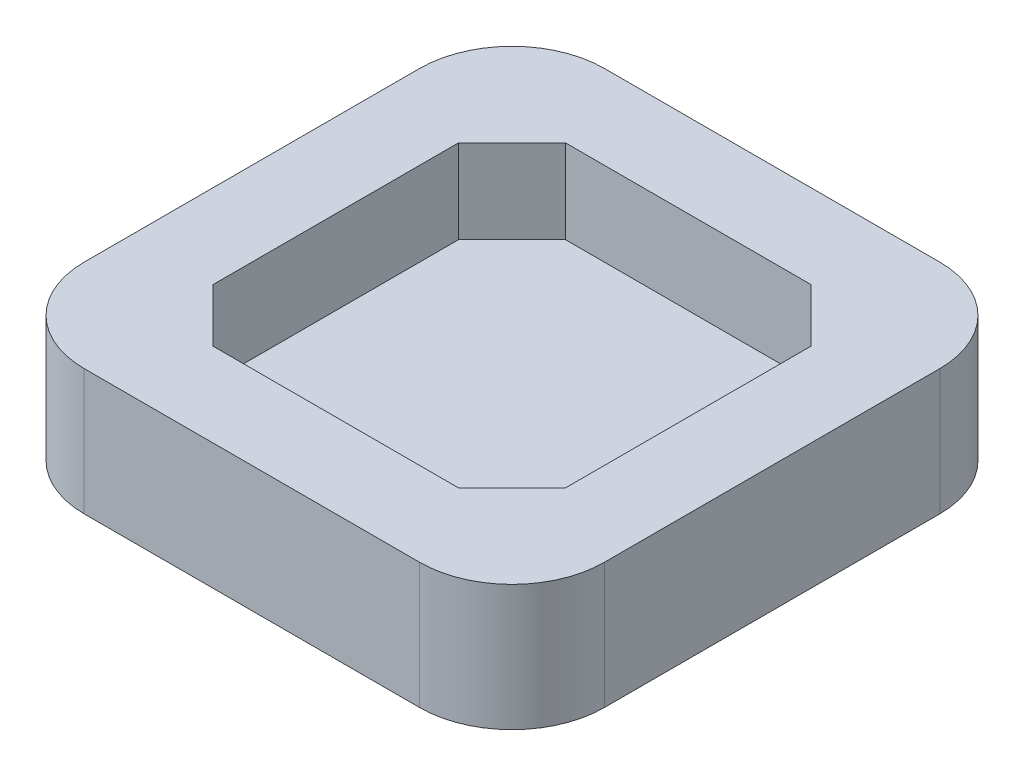
ISO-10303-21;
HEADER;
FILE_DESCRIPTION(('STEP AP214'),'2;1');
FILE_NAME('part.step','',(''),(''),'','','');
FILE_SCHEMA(('AUTOMOTIVE_DESIGN { 1 0 10303 214 1 1 1 1 }'));
ENDSEC;
DATA;
#1=APPLICATION_CONTEXT('core data for automotive mechanical design processes');
#2=APPLICATION_PROTOCOL_DEFINITION('international standard','automotive_design',2000,#1);
#3=PRODUCT_CONTEXT('',#1,'mechanical');
#4=PRODUCT('Part','Part','',(#3));
#5=PRODUCT_RELATED_PRODUCT_CATEGORY('part','',(#4));
#6=PRODUCT_DEFINITION_FORMATION('','',#4);
#7=PRODUCT_DEFINITION_CONTEXT('part definition',#1,'design');
#8=PRODUCT_DEFINITION('design','',#6,#7);
#9=PRODUCT_DEFINITION_SHAPE('','',#8);
#10=(LENGTH_UNIT() NAMED_UNIT(*) SI_UNIT(.MILLI.,.METRE.));
#11=(NAMED_UNIT(*) PLANE_ANGLE_UNIT() SI_UNIT($,.RADIAN.));
#12=(NAMED_UNIT(*) SI_UNIT($,.STERADIAN.) SOLID_ANGLE_UNIT());
#13=UNCERTAINTY_MEASURE_WITH_UNIT(LENGTH_MEASURE(1.E-05),#10,'distance_accuracy_value','');
#14=(GEOMETRIC_REPRESENTATION_CONTEXT(3) GLOBAL_UNCERTAINTY_ASSIGNED_CONTEXT((#13)) GLOBAL_UNIT_ASSIGNED_CONTEXT((#10,
#11,#12)) REPRESENTATION_CONTEXT('',''));
#15=CARTESIAN_POINT('',(0.,0.,0.));
#16=DIRECTION('',(0.,0.,1.));
#17=DIRECTION('',(1.,0.,0.));
#18=AXIS2_PLACEMENT_3D('',#15,#16,#17);
#19=CARTESIAN_POINT('',(0.,10.,31.));
#20=DIRECTION('',(0.,0.,-1.));
#21=DIRECTION('',(-1.,0.,0.));
#22=AXIS2_PLACEMENT_3D('',#19,#20,#21);
#23=PLANE('',#22);
#24=DIRECTION('',(1.,0.,0.));
#25=VECTOR('',#24,1.);
#26=CARTESIAN_POINT('',(0.,10.,31.));
#27=LINE('',#26,#25);
#28=CARTESIAN_POINT('',(-20.,10.,31.));
#29=VERTEX_POINT('',#28);
#30=CARTESIAN_POINT('',(20.,10.,31.));
#31=VERTEX_POINT('',#30);
#32=EDGE_CURVE('E234',#29,#31,#27,.T.);
#33=ORIENTED_EDGE('',*,*,#32,.F.);
#34=DIRECTION('',(0.,-1.,0.));
#35=VECTOR('',#34,1.);
#36=CARTESIAN_POINT('',(-20.,-5.,31.));
#37=LINE('',#36,#35);
#38=CARTESIAN_POINT('',(-20.,-5.,31.));
#39=VERTEX_POINT('',#38);
#40=EDGE_CURVE('E225',#29,#39,#37,.T.);
#41=ORIENTED_EDGE('',*,*,#40,.T.);
#42=DIRECTION('',(-1.,0.,0.));
#43=VECTOR('',#42,1.);
#44=CARTESIAN_POINT('',(31.,-5.,31.));
#45=LINE('',#44,#43);
#46=CARTESIAN_POINT('',(20.,-5.,31.));
#47=VERTEX_POINT('',#46);
#48=EDGE_CURVE('E232',#47,#39,#45,.T.);
#49=ORIENTED_EDGE('',*,*,#48,.F.);
#50=DIRECTION('',(0.,-1.,0.));
#51=VECTOR('',#50,1.);
#52=CARTESIAN_POINT('',(20.,10.,31.));
#53=LINE('',#52,#51);
#54=EDGE_CURVE('E223',#47,#31,#53,.F.);
#55=ORIENTED_EDGE('',*,*,#54,.T.);
#56=EDGE_LOOP('',(#33,#41,#49,#55));
#57=FACE_BOUND('',#56,.T.);
#58=ADVANCED_FACE('F35',(#57),#23,.F.);
#59=CARTESIAN_POINT('',(31.,10.,0.));
#60=DIRECTION('',(-1.,0.,0.));
#61=DIRECTION('',(0.,0.,1.));
#62=AXIS2_PLACEMENT_3D('',#59,#60,#61);
#63=PLANE('',#62);
#64=DIRECTION('',(0.,0.,-1.));
#65=VECTOR('',#64,1.);
#66=CARTESIAN_POINT('',(31.,10.,0.));
#67=LINE('',#66,#65);
#68=CARTESIAN_POINT('',(31.,10.,20.));
#69=VERTEX_POINT('',#68);
#70=CARTESIAN_POINT('',(31.,10.,-20.));
#71=VERTEX_POINT('',#70);
#72=EDGE_CURVE('E265',#69,#71,#67,.T.);
#73=ORIENTED_EDGE('',*,*,#72,.F.);
#74=DIRECTION('',(0.,-1.,0.));
#75=VECTOR('',#74,1.);
#76=CARTESIAN_POINT('',(31.,10.,20.));
#77=LINE('',#76,#75);
#78=CARTESIAN_POINT('',(31.,-5.,20.));
#79=VERTEX_POINT('',#78);
#80=EDGE_CURVE('E11',#69,#79,#77,.T.);
#81=ORIENTED_EDGE('',*,*,#80,.T.);
#82=DIRECTION('',(0.,0.,1.));
#83=VECTOR('',#82,1.);
#84=CARTESIAN_POINT('',(31.,-5.,-31.));
#85=LINE('',#84,#83);
#86=CARTESIAN_POINT('',(31.,-5.,-20.));
#87=VERTEX_POINT('',#86);
#88=EDGE_CURVE('E243',#87,#79,#85,.T.);
#89=ORIENTED_EDGE('',*,*,#88,.F.);
#90=DIRECTION('',(0.,-1.,0.));
#91=VECTOR('',#90,1.);
#92=CARTESIAN_POINT('',(31.,10.,-20.));
#93=LINE('',#92,#91);
#94=EDGE_CURVE('E43',#87,#71,#93,.F.);
#95=ORIENTED_EDGE('',*,*,#94,.T.);
#96=EDGE_LOOP('',(#73,#81,#89,#95));
#97=FACE_BOUND('',#96,.T.);
#98=ADVANCED_FACE('F326',(#97),#63,.F.);
#99=CARTESIAN_POINT('',(0.,10.,-31.));
#100=DIRECTION('',(0.,0.,-1.));
#101=DIRECTION('',(-1.,0.,0.));
#102=AXIS2_PLACEMENT_3D('',#99,#100,#101);
#103=PLANE('',#102);
#104=DIRECTION('',(1.,0.,0.));
#105=VECTOR('',#104,1.);
#106=CARTESIAN_POINT('',(31.,-5.,-31.));
#107=LINE('',#106,#105);
#108=CARTESIAN_POINT('',(-20.,-5.,-31.));
#109=VERTEX_POINT('',#108);
#110=CARTESIAN_POINT('',(20.,-5.,-31.));
#111=VERTEX_POINT('',#110);
#112=EDGE_CURVE('E245',#109,#111,#107,.T.);
#113=ORIENTED_EDGE('',*,*,#112,.F.);
#114=DIRECTION('',(0.,-1.,0.));
#115=VECTOR('',#114,1.);
#116=CARTESIAN_POINT('',(-20.,10.,-31.));
#117=LINE('',#116,#115);
#118=CARTESIAN_POINT('',(-20.,10.,-31.));
#119=VERTEX_POINT('',#118);
#120=EDGE_CURVE('E214',#109,#119,#117,.F.);
#121=ORIENTED_EDGE('',*,*,#120,.T.);
#122=DIRECTION('',(1.,0.,0.));
#123=VECTOR('',#122,1.);
#124=CARTESIAN_POINT('',(0.,10.,-31.));
#125=LINE('',#124,#123);
#126=CARTESIAN_POINT('',(20.,10.,-31.));
#127=VERTEX_POINT('',#126);
#128=EDGE_CURVE('E267',#119,#127,#125,.T.);
#129=ORIENTED_EDGE('',*,*,#128,.T.);
#130=DIRECTION('',(0.,-1.,0.));
#131=VECTOR('',#130,1.);
#132=CARTESIAN_POINT('',(20.,-5.,-31.));
#133=LINE('',#132,#131);
#134=EDGE_CURVE('E211',#127,#111,#133,.T.);
#135=ORIENTED_EDGE('',*,*,#134,.T.);
#136=EDGE_LOOP('',(#113,#121,#129,#135));
#137=FACE_BOUND('',#136,.T.);
#138=ADVANCED_FACE('F324',(#137),#103,.T.);
#139=CARTESIAN_POINT('',(-17.8180194846606,10.,-17.8180194846605));
#140=DIRECTION('',(-0.707106781186548,0.,-0.707106781186547));
#141=DIRECTION('',(-0.707106781186547,0.,0.707106781186548));
#142=AXIS2_PLACEMENT_3D('',#139,#140,#141);
#143=PLANE('',#142);
#144=DIRECTION('',(0.707106781186547,0.,-0.707106781186548));
#145=VECTOR('',#144,1.);
#146=CARTESIAN_POINT('',(-17.8180194846606,0.,-17.8180194846605));
#147=LINE('',#146,#145);
#148=CARTESIAN_POINT('',(-21.,0.,-14.6360389693211));
#149=VERTEX_POINT('',#148);
#150=CARTESIAN_POINT('',(-14.6360389693211,0.,-21.));
#151=VERTEX_POINT('',#150);
#152=EDGE_CURVE('E174',#149,#151,#147,.T.);
#153=ORIENTED_EDGE('',*,*,#152,.T.);
#154=DIRECTION('',(0.,-1.,0.));
#155=VECTOR('',#154,1.);
#156=CARTESIAN_POINT('',(-14.6360389693211,10.,-21.));
#157=LINE('',#156,#155);
#158=CARTESIAN_POINT('',(-14.6360389693211,10.,-21.));
#159=VERTEX_POINT('',#158);
#160=EDGE_CURVE('E196',#159,#151,#157,.T.);
#161=ORIENTED_EDGE('',*,*,#160,.F.);
#162=DIRECTION('',(0.707106781186547,0.,-0.707106781186548));
#163=VECTOR('',#162,1.);
#164=CARTESIAN_POINT('',(-17.8180194846606,10.,-17.8180194846605));
#165=LINE('',#164,#163);
#166=CARTESIAN_POINT('',(-21.,10.,-14.6360389693211));
#167=VERTEX_POINT('',#166);
#168=EDGE_CURVE('E175',#167,#159,#165,.T.);
#169=ORIENTED_EDGE('',*,*,#168,.F.);
#170=DIRECTION('',(0.,-1.,0.));
#171=VECTOR('',#170,1.);
#172=CARTESIAN_POINT('',(-21.,10.,-14.6360389693211));
#173=LINE('',#172,#171);
#174=EDGE_CURVE('E169',#167,#149,#173,.T.);
#175=ORIENTED_EDGE('',*,*,#174,.T.);
#176=EDGE_LOOP('',(#153,#161,#169,#175));
#177=FACE_BOUND('',#176,.T.);
#178=ADVANCED_FACE('F305',(#177),#143,.F.);
#179=CARTESIAN_POINT('',(0.,10.,-21.));
#180=DIRECTION('',(0.,0.,-1.));
#181=DIRECTION('',(-1.,0.,0.));
#182=AXIS2_PLACEMENT_3D('',#179,#180,#181);
#183=PLANE('',#182);
#184=DIRECTION('',(1.,0.,0.));
#185=VECTOR('',#184,1.);
#186=CARTESIAN_POINT('',(0.,0.,-21.));
#187=LINE('',#186,#185);
#188=CARTESIAN_POINT('',(14.6360389693211,0.,-21.));
#189=VERTEX_POINT('',#188);
#190=EDGE_CURVE('E273',#151,#189,#187,.T.);
#191=ORIENTED_EDGE('',*,*,#190,.T.);
#192=DIRECTION('',(0.,-1.,0.));
#193=VECTOR('',#192,1.);
#194=CARTESIAN_POINT('',(14.6360389693211,10.,-21.));
#195=LINE('',#194,#193);
#196=CARTESIAN_POINT('',(14.6360389693211,10.,-21.));
#197=VERTEX_POINT('',#196);
#198=EDGE_CURVE('E193',#197,#189,#195,.T.);
#199=ORIENTED_EDGE('',*,*,#198,.F.);
#200=DIRECTION('',(1.,0.,0.));
#201=VECTOR('',#200,1.);
#202=CARTESIAN_POINT('',(0.,10.,-21.));
#203=LINE('',#202,#201);
#204=EDGE_CURVE('E178',#159,#197,#203,.T.);
#205=ORIENTED_EDGE('',*,*,#204,.F.);
#206=ORIENTED_EDGE('',*,*,#160,.T.);
#207=EDGE_LOOP('',(#191,#199,#205,#206));
#208=FACE_BOUND('',#207,.T.);
#209=ADVANCED_FACE('F301',(#208),#183,.F.);
#210=CARTESIAN_POINT('',(17.8180194846606,10.,-17.8180194846605));
#211=DIRECTION('',(0.707106781186549,0.,-0.707106781186546));
#212=DIRECTION('',(-0.707106781186546,0.,-0.707106781186549));
#213=AXIS2_PLACEMENT_3D('',#210,#211,#212);
#214=PLANE('',#213);
#215=DIRECTION('',(0.707106781186546,0.,0.707106781186549));
#216=VECTOR('',#215,1.);
#217=CARTESIAN_POINT('',(17.8180194846606,0.,-17.8180194846605));
#218=LINE('',#217,#216);
#219=CARTESIAN_POINT('',(21.,0.,-14.6360389693211));
#220=VERTEX_POINT('',#219);
#221=EDGE_CURVE('E275',#189,#220,#218,.T.);
#222=ORIENTED_EDGE('',*,*,#221,.T.);
#223=DIRECTION('',(0.,-1.,0.));
#224=VECTOR('',#223,1.);
#225=CARTESIAN_POINT('',(21.,10.,-14.6360389693211));
#226=LINE('',#225,#224);
#227=CARTESIAN_POINT('',(21.,10.,-14.6360389693211));
#228=VERTEX_POINT('',#227);
#229=EDGE_CURVE('E190',#228,#220,#226,.T.);
#230=ORIENTED_EDGE('',*,*,#229,.F.);
#231=DIRECTION('',(0.707106781186546,0.,0.707106781186549));
#232=VECTOR('',#231,1.);
#233=CARTESIAN_POINT('',(17.8180194846606,10.,-17.8180194846605));
#234=LINE('',#233,#232);
#235=EDGE_CURVE('E252',#197,#228,#234,.T.);
#236=ORIENTED_EDGE('',*,*,#235,.F.);
#237=ORIENTED_EDGE('',*,*,#198,.T.);
#238=EDGE_LOOP('',(#222,#230,#236,#237));
#239=FACE_BOUND('',#238,.T.);
#240=ADVANCED_FACE('F297',(#239),#214,.F.);
#241=CARTESIAN_POINT('',(21.,10.,0.));
#242=DIRECTION('',(1.,0.,0.));
#243=DIRECTION('',(0.,0.,-1.));
#244=AXIS2_PLACEMENT_3D('',#241,#242,#243);
#245=PLANE('',#244);
#246=DIRECTION('',(0.,0.,1.));
#247=VECTOR('',#246,1.);
#248=CARTESIAN_POINT('',(21.,0.,0.));
#249=LINE('',#248,#247);
#250=CARTESIAN_POINT('',(21.,0.,14.636038969321));
#251=VERTEX_POINT('',#250);
#252=EDGE_CURVE('E277',#220,#251,#249,.T.);
#253=ORIENTED_EDGE('',*,*,#252,.T.);
#254=DIRECTION('',(0.,-1.,0.));
#255=VECTOR('',#254,1.);
#256=CARTESIAN_POINT('',(21.,10.,14.636038969321));
#257=LINE('',#256,#255);
#258=CARTESIAN_POINT('',(21.,10.,14.636038969321));
#259=VERTEX_POINT('',#258);
#260=EDGE_CURVE('E187',#259,#251,#257,.T.);
#261=ORIENTED_EDGE('',*,*,#260,.F.);
#262=DIRECTION('',(0.,0.,1.));
#263=VECTOR('',#262,1.);
#264=CARTESIAN_POINT('',(21.,10.,0.));
#265=LINE('',#264,#263);
#266=EDGE_CURVE('E254',#228,#259,#265,.T.);
#267=ORIENTED_EDGE('',*,*,#266,.F.);
#268=ORIENTED_EDGE('',*,*,#229,.T.);
#269=EDGE_LOOP('',(#253,#261,#267,#268));
#270=FACE_BOUND('',#269,.T.);
#271=ADVANCED_FACE('F293',(#270),#245,.F.);
#272=CARTESIAN_POINT('',(17.8180194846607,10.,17.8180194846604));
#273=DIRECTION('',(0.707106781186554,0.,0.707106781186542));
#274=DIRECTION('',(0.707106781186542,0.,-0.707106781186554));
#275=AXIS2_PLACEMENT_3D('',#272,#273,#274);
#276=PLANE('',#275);
#277=DIRECTION('',(-0.707106781186542,0.,0.707106781186554));
#278=VECTOR('',#277,1.);
#279=CARTESIAN_POINT('',(17.8180194846607,0.,17.8180194846604));
#280=LINE('',#279,#278);
#281=CARTESIAN_POINT('',(14.6360389693211,0.,21.));
#282=VERTEX_POINT('',#281);
#283=EDGE_CURVE('E279',#251,#282,#280,.T.);
#284=ORIENTED_EDGE('',*,*,#283,.T.);
#285=DIRECTION('',(0.,-1.,0.));
#286=VECTOR('',#285,1.);
#287=CARTESIAN_POINT('',(14.6360389693211,10.,21.));
#288=LINE('',#287,#286);
#289=CARTESIAN_POINT('',(14.6360389693211,10.,21.));
#290=VERTEX_POINT('',#289);
#291=EDGE_CURVE('E185',#290,#282,#288,.T.);
#292=ORIENTED_EDGE('',*,*,#291,.F.);
#293=DIRECTION('',(-0.707106781186542,0.,0.707106781186554));
#294=VECTOR('',#293,1.);
#295=CARTESIAN_POINT('',(17.8180194846607,10.,17.8180194846604));
#296=LINE('',#295,#294);
#297=EDGE_CURVE('E256',#259,#290,#296,.T.);
#298=ORIENTED_EDGE('',*,*,#297,.F.);
#299=ORIENTED_EDGE('',*,*,#260,.T.);
#300=EDGE_LOOP('',(#284,#292,#298,#299));
#301=FACE_BOUND('',#300,.T.);
#302=ADVANCED_FACE('F289',(#301),#276,.F.);
#303=CARTESIAN_POINT('',(0.,10.,21.));
#304=DIRECTION('',(0.,0.,-1.));
#305=DIRECTION('',(-1.,0.,0.));
#306=AXIS2_PLACEMENT_3D('',#303,#304,#305);
#307=PLANE('',#306);
#308=DIRECTION('',(1.,0.,0.));
#309=VECTOR('',#308,1.);
#310=CARTESIAN_POINT('',(0.,0.,21.));
#311=LINE('',#310,#309);
#312=CARTESIAN_POINT('',(-14.636038969321,0.,21.));
#313=VERTEX_POINT('',#312);
#314=EDGE_CURVE('E161',#313,#282,#311,.T.);
#315=ORIENTED_EDGE('',*,*,#314,.F.);
#316=DIRECTION('',(0.,-1.,0.));
#317=VECTOR('',#316,1.);
#318=CARTESIAN_POINT('',(-14.636038969321,10.,21.));
#319=LINE('',#318,#317);
#320=CARTESIAN_POINT('',(-14.636038969321,10.,21.));
#321=VERTEX_POINT('',#320);
#322=EDGE_CURVE('E155',#321,#313,#319,.T.);
#323=ORIENTED_EDGE('',*,*,#322,.F.);
#324=DIRECTION('',(1.,0.,0.));
#325=VECTOR('',#324,1.);
#326=CARTESIAN_POINT('',(0.,10.,21.));
#327=LINE('',#326,#325);
#328=EDGE_CURVE('E258',#321,#290,#327,.T.);
#329=ORIENTED_EDGE('',*,*,#328,.T.);
#330=ORIENTED_EDGE('',*,*,#291,.T.);
#331=EDGE_LOOP('',(#315,#323,#329,#330));
#332=FACE_BOUND('',#331,.T.);
#333=ADVANCED_FACE('F284',(#332),#307,.T.);
#334=CARTESIAN_POINT('',(-17.8180194846605,10.,17.8180194846606));
#335=DIRECTION('',(-0.707106781186544,0.,0.707106781186551));
#336=DIRECTION('',(0.707106781186551,0.,0.707106781186544));
#337=AXIS2_PLACEMENT_3D('',#334,#335,#336);
#338=PLANE('',#337);
#339=DIRECTION('',(-0.707106781186551,0.,-0.707106781186544));
#340=VECTOR('',#339,1.);
#341=CARTESIAN_POINT('',(-17.8180194846605,0.,17.8180194846606));
#342=LINE('',#341,#340);
#343=CARTESIAN_POINT('',(-21.,0.,14.6360389693211));
#344=VERTEX_POINT('',#343);
#345=EDGE_CURVE('E149',#313,#344,#342,.T.);
#346=ORIENTED_EDGE('',*,*,#345,.T.);
#347=DIRECTION('',(0.,-1.,0.));
#348=VECTOR('',#347,1.);
#349=CARTESIAN_POINT('',(-21.,10.,14.6360389693211));
#350=LINE('',#349,#348);
#351=CARTESIAN_POINT('',(-21.,10.,14.6360389693211));
#352=VERTEX_POINT('',#351);
#353=EDGE_CURVE('E153',#352,#344,#350,.T.);
#354=ORIENTED_EDGE('',*,*,#353,.F.);
#355=DIRECTION('',(-0.707106781186551,0.,-0.707106781186544));
#356=VECTOR('',#355,1.);
#357=CARTESIAN_POINT('',(-17.8180194846605,10.,17.8180194846606));
#358=LINE('',#357,#356);
#359=EDGE_CURVE('E261',#321,#352,#358,.T.);
#360=ORIENTED_EDGE('',*,*,#359,.F.);
#361=ORIENTED_EDGE('',*,*,#322,.T.);
#362=EDGE_LOOP('',(#346,#354,#360,#361));
#363=FACE_BOUND('',#362,.T.);
#364=ADVANCED_FACE('F151',(#363),#338,.F.);
#365=CARTESIAN_POINT('',(-21.,10.,0.));
#366=DIRECTION('',(1.,0.,0.));
#367=DIRECTION('',(0.,0.,-1.));
#368=AXIS2_PLACEMENT_3D('',#365,#366,#367);
#369=PLANE('',#368);
#370=DIRECTION('',(0.,0.,1.));
#371=VECTOR('',#370,1.);
#372=CARTESIAN_POINT('',(-21.,0.,0.));
#373=LINE('',#372,#371);
#374=EDGE_CURVE('E160',#149,#344,#373,.T.);
#375=ORIENTED_EDGE('',*,*,#374,.F.);
#376=ORIENTED_EDGE('',*,*,#174,.F.);
#377=DIRECTION('',(0.,0.,1.));
#378=VECTOR('',#377,1.);
#379=CARTESIAN_POINT('',(-21.,10.,0.));
#380=LINE('',#379,#378);
#381=EDGE_CURVE('E168',#167,#352,#380,.T.);
#382=ORIENTED_EDGE('',*,*,#381,.T.);
#383=ORIENTED_EDGE('',*,*,#353,.T.);
#384=EDGE_LOOP('',(#375,#376,#382,#383));
#385=FACE_BOUND('',#384,.T.);
#386=ADVANCED_FACE('F165',(#385),#369,.T.);
#387=CARTESIAN_POINT('',(-31.,10.,0.));
#388=DIRECTION('',(-1.,0.,0.));
#389=DIRECTION('',(0.,0.,1.));
#390=AXIS2_PLACEMENT_3D('',#387,#388,#389);
#391=PLANE('',#390);
#392=DIRECTION('',(0.,0.,-1.));
#393=VECTOR('',#392,1.);
#394=CARTESIAN_POINT('',(-31.,10.,0.));
#395=LINE('',#394,#393);
#396=CARTESIAN_POINT('',(-31.,10.,20.));
#397=VERTEX_POINT('',#396);
#398=CARTESIAN_POINT('',(-31.,10.,-20.));
#399=VERTEX_POINT('',#398);
#400=EDGE_CURVE('E182',#397,#399,#395,.T.);
#401=ORIENTED_EDGE('',*,*,#400,.T.);
#402=DIRECTION('',(0.,-1.,0.));
#403=VECTOR('',#402,1.);
#404=CARTESIAN_POINT('',(-31.,10.,-20.));
#405=LINE('',#404,#403);
#406=CARTESIAN_POINT('',(-31.,-5.,-20.));
#407=VERTEX_POINT('',#406);
#408=EDGE_CURVE('E200',#399,#407,#405,.T.);
#409=ORIENTED_EDGE('',*,*,#408,.T.);
#410=DIRECTION('',(0.,0.,-1.));
#411=VECTOR('',#410,1.);
#412=CARTESIAN_POINT('',(-31.,-5.,-31.));
#413=LINE('',#412,#411);
#414=CARTESIAN_POINT('',(-31.,-5.,20.));
#415=VERTEX_POINT('',#414);
#416=EDGE_CURVE('E242',#415,#407,#413,.T.);
#417=ORIENTED_EDGE('',*,*,#416,.F.);
#418=DIRECTION('',(0.,-1.,0.));
#419=VECTOR('',#418,1.);
#420=CARTESIAN_POINT('',(-31.,10.,20.));
#421=LINE('',#420,#419);
#422=EDGE_CURVE('E198',#415,#397,#421,.F.);
#423=ORIENTED_EDGE('',*,*,#422,.T.);
#424=EDGE_LOOP('',(#401,#409,#417,#423));
#425=FACE_BOUND('',#424,.T.);
#426=ADVANCED_FACE('F309',(#425),#391,.T.);
#427=CARTESIAN_POINT('',(0.,10.,0.));
#428=DIRECTION('',(0.,1.,0.));
#429=DIRECTION('',(0.,0.,1.));
#430=AXIS2_PLACEMENT_3D('',#427,#428,#429);
#431=PLANE('',#430);
#432=ORIENTED_EDGE('',*,*,#168,.T.);
#433=ORIENTED_EDGE('',*,*,#204,.T.);
#434=ORIENTED_EDGE('',*,*,#235,.T.);
#435=ORIENTED_EDGE('',*,*,#266,.T.);
#436=ORIENTED_EDGE('',*,*,#297,.T.);
#437=ORIENTED_EDGE('',*,*,#328,.F.);
#438=ORIENTED_EDGE('',*,*,#359,.T.);
#439=ORIENTED_EDGE('',*,*,#381,.F.);
#440=EDGE_LOOP('',(#432,#433,#434,#435,#436,#437,#438,#439));
#441=FACE_BOUND('',#440,.T.);
#442=ORIENTED_EDGE('',*,*,#128,.F.);
#443=CARTESIAN_POINT('',(-20.,10.,-20.));
#444=DIRECTION('',(0.,1.,0.));
#445=DIRECTION('',(0.,0.,1.));
#446=AXIS2_PLACEMENT_3D('',#443,#444,#445);
#447=CIRCLE('',#446,11.);
#448=EDGE_CURVE('E221',#119,#399,#447,.T.);
#449=ORIENTED_EDGE('',*,*,#448,.T.);
#450=ORIENTED_EDGE('',*,*,#400,.F.);
#451=CARTESIAN_POINT('',(-20.,10.,20.));
#452=DIRECTION('',(0.,1.,0.));
#453=DIRECTION('',(0.,0.,1.));
#454=AXIS2_PLACEMENT_3D('',#451,#452,#453);
#455=CIRCLE('',#454,11.);
#456=EDGE_CURVE('E219',#397,#29,#455,.T.);
#457=ORIENTED_EDGE('',*,*,#456,.T.);
#458=ORIENTED_EDGE('',*,*,#32,.T.);
#459=CARTESIAN_POINT('',(20.,10.,20.));
#460=DIRECTION('',(0.,1.,0.));
#461=DIRECTION('',(0.,0.,1.));
#462=AXIS2_PLACEMENT_3D('',#459,#460,#461);
#463=CIRCLE('',#462,11.);
#464=EDGE_CURVE('E56',#31,#69,#463,.T.);
#465=ORIENTED_EDGE('',*,*,#464,.T.);
#466=ORIENTED_EDGE('',*,*,#72,.T.);
#467=CARTESIAN_POINT('',(20.,10.,-20.));
#468=DIRECTION('',(0.,1.,0.));
#469=DIRECTION('',(0.,0.,1.));
#470=AXIS2_PLACEMENT_3D('',#467,#468,#469);
#471=CIRCLE('',#470,11.);
#472=EDGE_CURVE('E216',#71,#127,#471,.T.);
#473=ORIENTED_EDGE('',*,*,#472,.T.);
#474=EDGE_LOOP('',(#442,#449,#450,#457,#458,#465,#466,#473));
#475=FACE_BOUND('',#474,.T.);
#476=ADVANCED_FACE('F307',(#441,#475),#431,.T.);
#477=CARTESIAN_POINT('',(0.,-5.,0.));
#478=DIRECTION('',(0.,-1.,0.));
#479=DIRECTION('',(0.,0.,-1.));
#480=AXIS2_PLACEMENT_3D('',#477,#478,#479);
#481=PLANE('',#480);
#482=ORIENTED_EDGE('',*,*,#416,.T.);
#483=CARTESIAN_POINT('',(-20.,-5.,-20.));
#484=DIRECTION('',(0.,-1.,0.));
#485=DIRECTION('',(0.,0.,-1.));
#486=AXIS2_PLACEMENT_3D('',#483,#484,#485);
#487=CIRCLE('',#486,11.);
#488=EDGE_CURVE('E209',#407,#109,#487,.T.);
#489=ORIENTED_EDGE('',*,*,#488,.T.);
#490=ORIENTED_EDGE('',*,*,#112,.T.);
#491=CARTESIAN_POINT('',(20.,-5.,-20.));
#492=DIRECTION('',(0.,-1.,0.));
#493=DIRECTION('',(0.,0.,-1.));
#494=AXIS2_PLACEMENT_3D('',#491,#492,#493);
#495=CIRCLE('',#494,11.);
#496=EDGE_CURVE('E203',#111,#87,#495,.T.);
#497=ORIENTED_EDGE('',*,*,#496,.T.);
#498=ORIENTED_EDGE('',*,*,#88,.T.);
#499=CARTESIAN_POINT('',(20.,-5.,20.));
#500=DIRECTION('',(0.,-1.,0.));
#501=DIRECTION('',(0.,0.,-1.));
#502=AXIS2_PLACEMENT_3D('',#499,#500,#501);
#503=CIRCLE('',#502,11.);
#504=EDGE_CURVE('E205',#79,#47,#503,.T.);
#505=ORIENTED_EDGE('',*,*,#504,.T.);
#506=ORIENTED_EDGE('',*,*,#48,.T.);
#507=CARTESIAN_POINT('',(-20.,-5.,20.));
#508=DIRECTION('',(0.,-1.,0.));
#509=DIRECTION('',(0.,0.,-1.));
#510=AXIS2_PLACEMENT_3D('',#507,#508,#509);
#511=CIRCLE('',#510,11.);
#512=EDGE_CURVE('E207',#39,#415,#511,.T.);
#513=ORIENTED_EDGE('',*,*,#512,.T.);
#514=EDGE_LOOP('',(#482,#489,#490,#497,#498,#505,#506,#513));
#515=FACE_BOUND('',#514,.T.);
#516=ADVANCED_FACE('F239',(#515),#481,.T.);
#517=CARTESIAN_POINT('',(0.,0.,0.));
#518=DIRECTION('',(0.,-1.,0.));
#519=DIRECTION('',(0.,0.,-1.));
#520=AXIS2_PLACEMENT_3D('',#517,#518,#519);
#521=PLANE('',#520);
#522=ORIENTED_EDGE('',*,*,#190,.F.);
#523=ORIENTED_EDGE('',*,*,#152,.F.);
#524=ORIENTED_EDGE('',*,*,#374,.T.);
#525=ORIENTED_EDGE('',*,*,#345,.F.);
#526=ORIENTED_EDGE('',*,*,#314,.T.);
#527=ORIENTED_EDGE('',*,*,#283,.F.);
#528=ORIENTED_EDGE('',*,*,#252,.F.);
#529=ORIENTED_EDGE('',*,*,#221,.F.);
#530=EDGE_LOOP('',(#522,#523,#524,#525,#526,#527,#528,#529));
#531=FACE_BOUND('',#530,.T.);
#532=ADVANCED_FACE('F172',(#531),#521,.F.);
#533=CARTESIAN_POINT('',(-20.,10.,-20.));
#534=DIRECTION('',(0.,-1.,0.));
#535=DIRECTION('',(0.,0.,-1.));
#536=AXIS2_PLACEMENT_3D('',#533,#534,#535);
#537=CYLINDRICAL_SURFACE('',#536,11.);
#538=ORIENTED_EDGE('',*,*,#448,.F.);
#539=ORIENTED_EDGE('',*,*,#120,.F.);
#540=ORIENTED_EDGE('',*,*,#488,.F.);
#541=ORIENTED_EDGE('',*,*,#408,.F.);
#542=EDGE_LOOP('',(#538,#539,#540,#541));
#543=FACE_BOUND('',#542,.T.);
#544=ADVANCED_FACE('F320',(#543),#537,.T.);
#545=CARTESIAN_POINT('',(-20.,10.,20.));
#546=DIRECTION('',(0.,1.,0.));
#547=DIRECTION('',(0.,0.,1.));
#548=AXIS2_PLACEMENT_3D('',#545,#546,#547);
#549=CYLINDRICAL_SURFACE('',#548,11.);
#550=ORIENTED_EDGE('',*,*,#456,.F.);
#551=ORIENTED_EDGE('',*,*,#422,.F.);
#552=ORIENTED_EDGE('',*,*,#512,.F.);
#553=ORIENTED_EDGE('',*,*,#40,.F.);
#554=EDGE_LOOP('',(#550,#551,#552,#553));
#555=FACE_BOUND('',#554,.T.);
#556=ADVANCED_FACE('F330',(#555),#549,.T.);
#557=CARTESIAN_POINT('',(20.,10.,20.));
#558=DIRECTION('',(0.,-1.,0.));
#559=DIRECTION('',(0.,0.,-1.));
#560=AXIS2_PLACEMENT_3D('',#557,#558,#559);
#561=CYLINDRICAL_SURFACE('',#560,11.);
#562=ORIENTED_EDGE('',*,*,#464,.F.);
#563=ORIENTED_EDGE('',*,*,#54,.F.);
#564=ORIENTED_EDGE('',*,*,#504,.F.);
#565=ORIENTED_EDGE('',*,*,#80,.F.);
#566=EDGE_LOOP('',(#562,#563,#564,#565));
#567=FACE_BOUND('',#566,.T.);
#568=ADVANCED_FACE('F329',(#567),#561,.T.);
#569=CARTESIAN_POINT('',(20.,10.,-20.));
#570=DIRECTION('',(0.,1.,0.));
#571=DIRECTION('',(0.,0.,1.));
#572=AXIS2_PLACEMENT_3D('',#569,#570,#571);
#573=CYLINDRICAL_SURFACE('',#572,11.);
#574=ORIENTED_EDGE('',*,*,#472,.F.);
#575=ORIENTED_EDGE('',*,*,#94,.F.);
#576=ORIENTED_EDGE('',*,*,#496,.F.);
#577=ORIENTED_EDGE('',*,*,#134,.F.);
#578=EDGE_LOOP('',(#574,#575,#576,#577));
#579=FACE_BOUND('',#578,.T.);
#580=ADVANCED_FACE('F37',(#579),#573,.T.);
#581=CLOSED_SHELL('',(#58,#98,#138,#178,#209,#240,#271,#302,#333,#364,#386,#426,#476,#516,#532,
#544,#556,#568,#580));
#582=MANIFOLD_SOLID_BREP('B2',#581);
#583=ADVANCED_BREP_SHAPE_REPRESENTATION('',(#18,#582),#14);
#584=SHAPE_DEFINITION_REPRESENTATION(#9,#583);
ENDSEC;
END-ISO-10303-21;
